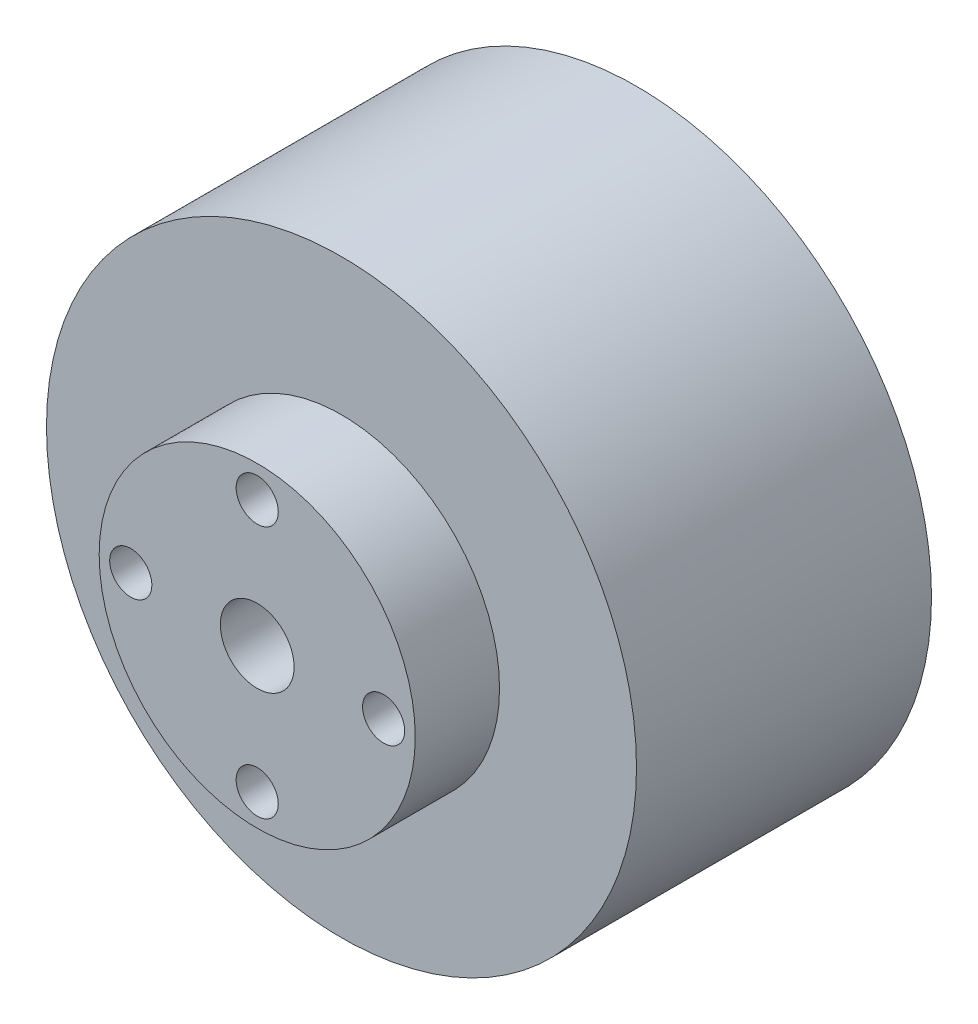
ISO-10303-21;
HEADER;
FILE_DESCRIPTION(('STEP AP214'),'2;1');
FILE_NAME('part.step','',(''),(''),'','','');
FILE_SCHEMA(('AUTOMOTIVE_DESIGN { 1 0 10303 214 1 1 1 1 }'));
ENDSEC;
DATA;
#1=APPLICATION_CONTEXT('core data for automotive mechanical design processes');
#2=APPLICATION_PROTOCOL_DEFINITION('international standard','automotive_design',2000,#1);
#3=PRODUCT_CONTEXT('',#1,'mechanical');
#4=PRODUCT('Part','Part','',(#3));
#5=PRODUCT_RELATED_PRODUCT_CATEGORY('part','',(#4));
#6=PRODUCT_DEFINITION_FORMATION('','',#4);
#7=PRODUCT_DEFINITION_CONTEXT('part definition',#1,'design');
#8=PRODUCT_DEFINITION('design','',#6,#7);
#9=PRODUCT_DEFINITION_SHAPE('','',#8);
#10=(LENGTH_UNIT() NAMED_UNIT(*) SI_UNIT(.MILLI.,.METRE.));
#11=(NAMED_UNIT(*) PLANE_ANGLE_UNIT() SI_UNIT($,.RADIAN.));
#12=(NAMED_UNIT(*) SI_UNIT($,.STERADIAN.) SOLID_ANGLE_UNIT());
#13=UNCERTAINTY_MEASURE_WITH_UNIT(LENGTH_MEASURE(1.E-05),#10,'distance_accuracy_value','');
#14=(GEOMETRIC_REPRESENTATION_CONTEXT(3) GLOBAL_UNCERTAINTY_ASSIGNED_CONTEXT((#13)) GLOBAL_UNIT_ASSIGNED_CONTEXT((#10,
#11,#12)) REPRESENTATION_CONTEXT('',''));
#15=CARTESIAN_POINT('',(0.,0.,0.));
#16=DIRECTION('',(0.,0.,1.));
#17=DIRECTION('',(1.,0.,0.));
#18=AXIS2_PLACEMENT_3D('',#15,#16,#17);
#19=CARTESIAN_POINT('',(0.,0.,14.));
#20=DIRECTION('',(0.,0.,-1.));
#21=DIRECTION('',(-1.,0.,0.));
#22=AXIS2_PLACEMENT_3D('',#19,#20,#21);
#23=CYLINDRICAL_SURFACE('',#22,14.);
#24=CARTESIAN_POINT('',(0.,0.,14.));
#25=DIRECTION('',(0.,0.,1.));
#26=DIRECTION('',(1.,0.,0.));
#27=AXIS2_PLACEMENT_3D('',#24,#25,#26);
#28=CIRCLE('',#27,14.);
#29=CARTESIAN_POINT('',(14.,0.,14.));
#30=VERTEX_POINT('',#29);
#31=EDGE_CURVE('E46',#30,#30,#28,.T.);
#32=ORIENTED_EDGE('',*,*,#31,.F.);
#33=EDGE_LOOP('',(#32));
#34=FACE_BOUND('',#33,.T.);
#35=CARTESIAN_POINT('',(0.,0.,0.));
#36=DIRECTION('',(0.,0.,1.));
#37=DIRECTION('',(1.,0.,0.));
#38=AXIS2_PLACEMENT_3D('',#35,#36,#37);
#39=CIRCLE('',#38,14.);
#40=CARTESIAN_POINT('',(14.,0.,0.));
#41=VERTEX_POINT('',#40);
#42=EDGE_CURVE('E41',#41,#41,#39,.T.);
#43=ORIENTED_EDGE('',*,*,#42,.T.);
#44=EDGE_LOOP('',(#43));
#45=FACE_BOUND('',#44,.T.);
#46=ADVANCED_FACE('F38',(#34,#45),#23,.T.);
#47=CARTESIAN_POINT('',(0.,0.,14.));
#48=DIRECTION('',(0.,0.,1.));
#49=DIRECTION('',(1.,0.,0.));
#50=AXIS2_PLACEMENT_3D('',#47,#48,#49);
#51=PLANE('',#50);
#52=CARTESIAN_POINT('',(0.,0.,14.));
#53=DIRECTION('',(0.,0.,1.));
#54=DIRECTION('',(1.,0.,0.));
#55=AXIS2_PLACEMENT_3D('',#52,#53,#54);
#56=CIRCLE('',#55,7.5);
#57=CARTESIAN_POINT('',(7.5,0.,14.));
#58=VERTEX_POINT('',#57);
#59=EDGE_CURVE('E10',#58,#58,#56,.T.);
#60=ORIENTED_EDGE('',*,*,#59,.F.);
#61=EDGE_LOOP('',(#60));
#62=FACE_BOUND('',#61,.T.);
#63=ORIENTED_EDGE('',*,*,#31,.T.);
#64=EDGE_LOOP('',(#63));
#65=FACE_BOUND('',#64,.T.);
#66=ADVANCED_FACE('F142',(#62,#65),#51,.T.);
#67=CARTESIAN_POINT('',(0.,0.,0.));
#68=DIRECTION('',(0.,0.,1.));
#69=DIRECTION('',(1.,0.,0.));
#70=AXIS2_PLACEMENT_3D('',#67,#68,#69);
#71=PLANE('',#70);
#72=CARTESIAN_POINT('',(0.,8.,0.));
#73=DIRECTION('',(0.,0.,1.));
#74=DIRECTION('',(1.,0.,0.));
#75=AXIS2_PLACEMENT_3D('',#72,#73,#74);
#76=CIRCLE('',#75,1.5);
#77=CARTESIAN_POINT('',(1.5,8.,0.));
#78=VERTEX_POINT('',#77);
#79=EDGE_CURVE('E122',#78,#78,#76,.T.);
#80=ORIENTED_EDGE('',*,*,#79,.T.);
#81=EDGE_LOOP('',(#80));
#82=FACE_BOUND('',#81,.T.);
#83=CARTESIAN_POINT('',(-8.,0.,0.));
#84=DIRECTION('',(0.,0.,1.));
#85=DIRECTION('',(1.,0.,0.));
#86=AXIS2_PLACEMENT_3D('',#83,#84,#85);
#87=CIRCLE('',#86,1.5);
#88=CARTESIAN_POINT('',(-6.5,0.,0.));
#89=VERTEX_POINT('',#88);
#90=EDGE_CURVE('E114',#89,#89,#87,.T.);
#91=ORIENTED_EDGE('',*,*,#90,.T.);
#92=EDGE_LOOP('',(#91));
#93=FACE_BOUND('',#92,.T.);
#94=CARTESIAN_POINT('',(0.,-8.,0.));
#95=DIRECTION('',(0.,0.,1.));
#96=DIRECTION('',(1.,0.,0.));
#97=AXIS2_PLACEMENT_3D('',#94,#95,#96);
#98=CIRCLE('',#97,1.5);
#99=CARTESIAN_POINT('',(1.5,-8.,0.));
#100=VERTEX_POINT('',#99);
#101=EDGE_CURVE('E106',#100,#100,#98,.T.);
#102=ORIENTED_EDGE('',*,*,#101,.T.);
#103=EDGE_LOOP('',(#102));
#104=FACE_BOUND('',#103,.T.);
#105=CARTESIAN_POINT('',(8.,0.,0.));
#106=DIRECTION('',(0.,0.,1.));
#107=DIRECTION('',(1.,0.,0.));
#108=AXIS2_PLACEMENT_3D('',#105,#106,#107);
#109=CIRCLE('',#108,1.5);
#110=CARTESIAN_POINT('',(9.5,0.,0.));
#111=VERTEX_POINT('',#110);
#112=EDGE_CURVE('E98',#111,#111,#109,.T.);
#113=ORIENTED_EDGE('',*,*,#112,.T.);
#114=EDGE_LOOP('',(#113));
#115=FACE_BOUND('',#114,.T.);
#116=CARTESIAN_POINT('',(0.,0.,0.));
#117=DIRECTION('',(0.,0.,1.));
#118=DIRECTION('',(1.,0.,0.));
#119=AXIS2_PLACEMENT_3D('',#116,#117,#118);
#120=CIRCLE('',#119,1.75);
#121=CARTESIAN_POINT('',(1.75,0.,0.));
#122=VERTEX_POINT('',#121);
#123=EDGE_CURVE('E57',#122,#122,#120,.T.);
#124=ORIENTED_EDGE('',*,*,#123,.T.);
#125=EDGE_LOOP('',(#124));
#126=FACE_BOUND('',#125,.T.);
#127=ORIENTED_EDGE('',*,*,#42,.F.);
#128=EDGE_LOOP('',(#127));
#129=FACE_BOUND('',#128,.T.);
#130=ADVANCED_FACE('F147',(#82,#93,#104,#115,#126,#129),#71,.F.);
#131=CARTESIAN_POINT('',(0.,0.,18.));
#132=DIRECTION('',(0.,0.,-1.));
#133=DIRECTION('',(-1.,0.,0.));
#134=AXIS2_PLACEMENT_3D('',#131,#132,#133);
#135=CYLINDRICAL_SURFACE('',#134,7.5);
#136=CARTESIAN_POINT('',(0.,0.,18.));
#137=DIRECTION('',(0.,0.,1.));
#138=DIRECTION('',(1.,0.,0.));
#139=AXIS2_PLACEMENT_3D('',#136,#137,#138);
#140=CIRCLE('',#139,7.5);
#141=CARTESIAN_POINT('',(7.5,0.,18.));
#142=VERTEX_POINT('',#141);
#143=EDGE_CURVE('E53',#142,#142,#140,.T.);
#144=ORIENTED_EDGE('',*,*,#143,.F.);
#145=EDGE_LOOP('',(#144));
#146=FACE_BOUND('',#145,.T.);
#147=ORIENTED_EDGE('',*,*,#59,.T.);
#148=EDGE_LOOP('',(#147));
#149=FACE_BOUND('',#148,.T.);
#150=ADVANCED_FACE('F157',(#146,#149),#135,.T.);
#151=CARTESIAN_POINT('',(0.,0.,18.));
#152=DIRECTION('',(0.,0.,1.));
#153=DIRECTION('',(1.,0.,0.));
#154=AXIS2_PLACEMENT_3D('',#151,#152,#153);
#155=PLANE('',#154);
#156=CARTESIAN_POINT('',(6.00000000000001,0.,18.));
#157=DIRECTION('',(0.,0.,1.));
#158=DIRECTION('',(1.,0.,0.));
#159=AXIS2_PLACEMENT_3D('',#156,#157,#158);
#160=CIRCLE('',#159,1.);
#161=CARTESIAN_POINT('',(7.00000000000001,0.,18.));
#162=VERTEX_POINT('',#161);
#163=EDGE_CURVE('E91',#162,#162,#160,.T.);
#164=ORIENTED_EDGE('',*,*,#163,.F.);
#165=EDGE_LOOP('',(#164));
#166=FACE_BOUND('',#165,.T.);
#167=CARTESIAN_POINT('',(-6.00000000000001,0.,18.));
#168=DIRECTION('',(0.,0.,1.));
#169=DIRECTION('',(1.,0.,0.));
#170=AXIS2_PLACEMENT_3D('',#167,#168,#169);
#171=CIRCLE('',#170,1.);
#172=CARTESIAN_POINT('',(-5.00000000000001,0.,18.));
#173=VERTEX_POINT('',#172);
#174=EDGE_CURVE('E87',#173,#173,#171,.T.);
#175=ORIENTED_EDGE('',*,*,#174,.F.);
#176=EDGE_LOOP('',(#175));
#177=FACE_BOUND('',#176,.T.);
#178=CARTESIAN_POINT('',(0.,-6.,18.));
#179=DIRECTION('',(0.,0.,1.));
#180=DIRECTION('',(1.,0.,0.));
#181=AXIS2_PLACEMENT_3D('',#178,#179,#180);
#182=CIRCLE('',#181,1.);
#183=CARTESIAN_POINT('',(1.,-6.,18.));
#184=VERTEX_POINT('',#183);
#185=EDGE_CURVE('E79',#184,#184,#182,.T.);
#186=ORIENTED_EDGE('',*,*,#185,.F.);
#187=EDGE_LOOP('',(#186));
#188=FACE_BOUND('',#187,.T.);
#189=CARTESIAN_POINT('',(0.,6.,18.));
#190=DIRECTION('',(0.,0.,1.));
#191=DIRECTION('',(1.,0.,0.));
#192=AXIS2_PLACEMENT_3D('',#189,#190,#191);
#193=CIRCLE('',#192,1.);
#194=CARTESIAN_POINT('',(1.,6.,18.));
#195=VERTEX_POINT('',#194);
#196=EDGE_CURVE('E70',#195,#195,#193,.T.);
#197=ORIENTED_EDGE('',*,*,#196,.F.);
#198=EDGE_LOOP('',(#197));
#199=FACE_BOUND('',#198,.T.);
#200=CARTESIAN_POINT('',(0.,0.,18.));
#201=DIRECTION('',(0.,0.,1.));
#202=DIRECTION('',(1.,0.,0.));
#203=AXIS2_PLACEMENT_3D('',#200,#201,#202);
#204=CIRCLE('',#203,1.75);
#205=CARTESIAN_POINT('',(1.75,0.,18.));
#206=VERTEX_POINT('',#205);
#207=EDGE_CURVE('E58',#206,#206,#204,.T.);
#208=ORIENTED_EDGE('',*,*,#207,.F.);
#209=EDGE_LOOP('',(#208));
#210=FACE_BOUND('',#209,.T.);
#211=ORIENTED_EDGE('',*,*,#143,.T.);
#212=EDGE_LOOP('',(#211));
#213=FACE_BOUND('',#212,.T.);
#214=ADVANCED_FACE('F163',(#166,#177,#188,#199,#210,#213),#155,.T.);
#215=CARTESIAN_POINT('',(0.,0.,0.));
#216=DIRECTION('',(0.,0.,1.));
#217=DIRECTION('',(1.,0.,0.));
#218=AXIS2_PLACEMENT_3D('',#215,#216,#217);
#219=CYLINDRICAL_SURFACE('',#218,1.75);
#220=ORIENTED_EDGE('',*,*,#123,.F.);
#221=EDGE_LOOP('',(#220));
#222=FACE_BOUND('',#221,.T.);
#223=ORIENTED_EDGE('',*,*,#207,.T.);
#224=EDGE_LOOP('',(#223));
#225=FACE_BOUND('',#224,.T.);
#226=ADVANCED_FACE('F170',(#222,#225),#219,.F.);
#227=CARTESIAN_POINT('',(0.,6.,15.));
#228=DIRECTION('',(0.,0.,1.));
#229=DIRECTION('',(1.,0.,0.));
#230=AXIS2_PLACEMENT_3D('',#227,#228,#229);
#231=CYLINDRICAL_SURFACE('',#230,1.);
#232=CARTESIAN_POINT('',(0.,6.,15.));
#233=DIRECTION('',(0.,0.,1.));
#234=DIRECTION('',(1.,0.,0.));
#235=AXIS2_PLACEMENT_3D('',#232,#233,#234);
#236=CIRCLE('',#235,1.);
#237=CARTESIAN_POINT('',(1.,6.,15.));
#238=VERTEX_POINT('',#237);
#239=EDGE_CURVE('E66',#238,#238,#236,.T.);
#240=ORIENTED_EDGE('',*,*,#239,.F.);
#241=EDGE_LOOP('',(#240));
#242=FACE_BOUND('',#241,.T.);
#243=ORIENTED_EDGE('',*,*,#196,.T.);
#244=EDGE_LOOP('',(#243));
#245=FACE_BOUND('',#244,.T.);
#246=ADVANCED_FACE('F174',(#242,#245),#231,.F.);
#247=CARTESIAN_POINT('',(0.,6.,15.));
#248=DIRECTION('',(0.,0.,1.));
#249=DIRECTION('',(1.,0.,0.));
#250=AXIS2_PLACEMENT_3D('',#247,#248,#249);
#251=PLANE('',#250);
#252=ORIENTED_EDGE('',*,*,#239,.T.);
#253=EDGE_LOOP('',(#252));
#254=FACE_BOUND('',#253,.T.);
#255=ADVANCED_FACE('F176',(#254),#251,.T.);
#256=CARTESIAN_POINT('',(0.,-6.,15.));
#257=DIRECTION('',(0.,0.,1.));
#258=DIRECTION('',(1.,0.,0.));
#259=AXIS2_PLACEMENT_3D('',#256,#257,#258);
#260=CYLINDRICAL_SURFACE('',#259,1.);
#261=CARTESIAN_POINT('',(0.,-6.,15.));
#262=DIRECTION('',(0.,0.,1.));
#263=DIRECTION('',(1.,0.,0.));
#264=AXIS2_PLACEMENT_3D('',#261,#262,#263);
#265=CIRCLE('',#264,1.);
#266=CARTESIAN_POINT('',(1.,-6.,15.));
#267=VERTEX_POINT('',#266);
#268=EDGE_CURVE('E75',#267,#267,#265,.T.);
#269=ORIENTED_EDGE('',*,*,#268,.F.);
#270=EDGE_LOOP('',(#269));
#271=FACE_BOUND('',#270,.T.);
#272=ORIENTED_EDGE('',*,*,#185,.T.);
#273=EDGE_LOOP('',(#272));
#274=FACE_BOUND('',#273,.T.);
#275=ADVANCED_FACE('F179',(#271,#274),#260,.F.);
#276=CARTESIAN_POINT('',(0.,-6.,15.));
#277=DIRECTION('',(0.,0.,1.));
#278=DIRECTION('',(1.,0.,0.));
#279=AXIS2_PLACEMENT_3D('',#276,#277,#278);
#280=PLANE('',#279);
#281=ORIENTED_EDGE('',*,*,#268,.T.);
#282=EDGE_LOOP('',(#281));
#283=FACE_BOUND('',#282,.T.);
#284=ADVANCED_FACE('F184',(#283),#280,.T.);
#285=CARTESIAN_POINT('',(-6.00000000000001,0.,15.));
#286=DIRECTION('',(0.,0.,1.));
#287=DIRECTION('',(1.,0.,0.));
#288=AXIS2_PLACEMENT_3D('',#285,#286,#287);
#289=CYLINDRICAL_SURFACE('',#288,1.);
#290=CARTESIAN_POINT('',(-6.00000000000001,0.,15.));
#291=DIRECTION('',(0.,0.,1.));
#292=DIRECTION('',(1.,0.,0.));
#293=AXIS2_PLACEMENT_3D('',#290,#291,#292);
#294=CIRCLE('',#293,1.);
#295=CARTESIAN_POINT('',(-5.00000000000001,0.,15.));
#296=VERTEX_POINT('',#295);
#297=EDGE_CURVE('E83',#296,#296,#294,.T.);
#298=ORIENTED_EDGE('',*,*,#297,.F.);
#299=EDGE_LOOP('',(#298));
#300=FACE_BOUND('',#299,.T.);
#301=ORIENTED_EDGE('',*,*,#174,.T.);
#302=EDGE_LOOP('',(#301));
#303=FACE_BOUND('',#302,.T.);
#304=ADVANCED_FACE('F187',(#300,#303),#289,.F.);
#305=CARTESIAN_POINT('',(-6.00000000000001,0.,15.));
#306=DIRECTION('',(0.,0.,1.));
#307=DIRECTION('',(1.,0.,0.));
#308=AXIS2_PLACEMENT_3D('',#305,#306,#307);
#309=PLANE('',#308);
#310=ORIENTED_EDGE('',*,*,#297,.T.);
#311=EDGE_LOOP('',(#310));
#312=FACE_BOUND('',#311,.T.);
#313=ADVANCED_FACE('F192',(#312),#309,.T.);
#314=CARTESIAN_POINT('',(6.00000000000001,0.,15.));
#315=DIRECTION('',(0.,0.,1.));
#316=DIRECTION('',(1.,0.,0.));
#317=AXIS2_PLACEMENT_3D('',#314,#315,#316);
#318=CYLINDRICAL_SURFACE('',#317,1.);
#319=CARTESIAN_POINT('',(6.00000000000001,0.,15.));
#320=DIRECTION('',(0.,0.,1.));
#321=DIRECTION('',(1.,0.,0.));
#322=AXIS2_PLACEMENT_3D('',#319,#320,#321);
#323=CIRCLE('',#322,1.);
#324=CARTESIAN_POINT('',(7.00000000000001,0.,15.));
#325=VERTEX_POINT('',#324);
#326=EDGE_CURVE('E62',#325,#325,#323,.T.);
#327=ORIENTED_EDGE('',*,*,#326,.F.);
#328=EDGE_LOOP('',(#327));
#329=FACE_BOUND('',#328,.T.);
#330=ORIENTED_EDGE('',*,*,#163,.T.);
#331=EDGE_LOOP('',(#330));
#332=FACE_BOUND('',#331,.T.);
#333=ADVANCED_FACE('F195',(#329,#332),#318,.F.);
#334=CARTESIAN_POINT('',(6.00000000000001,0.,15.));
#335=DIRECTION('',(0.,0.,1.));
#336=DIRECTION('',(1.,0.,0.));
#337=AXIS2_PLACEMENT_3D('',#334,#335,#336);
#338=PLANE('',#337);
#339=ORIENTED_EDGE('',*,*,#326,.T.);
#340=EDGE_LOOP('',(#339));
#341=FACE_BOUND('',#340,.T.);
#342=ADVANCED_FACE('F202',(#341),#338,.T.);
#343=CARTESIAN_POINT('',(8.,0.,3.));
#344=DIRECTION('',(0.,0.,-1.));
#345=DIRECTION('',(-1.,0.,0.));
#346=AXIS2_PLACEMENT_3D('',#343,#344,#345);
#347=CYLINDRICAL_SURFACE('',#346,1.5);
#348=CARTESIAN_POINT('',(8.,0.,3.));
#349=DIRECTION('',(0.,0.,1.));
#350=DIRECTION('',(1.,0.,0.));
#351=AXIS2_PLACEMENT_3D('',#348,#349,#350);
#352=CIRCLE('',#351,1.5);
#353=CARTESIAN_POINT('',(9.5,0.,3.));
#354=VERTEX_POINT('',#353);
#355=EDGE_CURVE('E102',#354,#354,#352,.T.);
#356=ORIENTED_EDGE('',*,*,#355,.T.);
#357=EDGE_LOOP('',(#356));
#358=FACE_BOUND('',#357,.T.);
#359=ORIENTED_EDGE('',*,*,#112,.F.);
#360=EDGE_LOOP('',(#359));
#361=FACE_BOUND('',#360,.T.);
#362=ADVANCED_FACE('F206',(#358,#361),#347,.F.);
#363=CARTESIAN_POINT('',(8.,0.,3.));
#364=DIRECTION('',(0.,0.,1.));
#365=DIRECTION('',(1.,0.,0.));
#366=AXIS2_PLACEMENT_3D('',#363,#364,#365);
#367=PLANE('',#366);
#368=ORIENTED_EDGE('',*,*,#355,.F.);
#369=EDGE_LOOP('',(#368));
#370=FACE_BOUND('',#369,.T.);
#371=ADVANCED_FACE('F210',(#370),#367,.F.);
#372=CARTESIAN_POINT('',(0.,-8.,3.));
#373=DIRECTION('',(0.,0.,-1.));
#374=DIRECTION('',(-1.,0.,0.));
#375=AXIS2_PLACEMENT_3D('',#372,#373,#374);
#376=CYLINDRICAL_SURFACE('',#375,1.5);
#377=CARTESIAN_POINT('',(0.,-8.,3.));
#378=DIRECTION('',(0.,0.,1.));
#379=DIRECTION('',(1.,0.,0.));
#380=AXIS2_PLACEMENT_3D('',#377,#378,#379);
#381=CIRCLE('',#380,1.5);
#382=CARTESIAN_POINT('',(1.5,-8.,3.));
#383=VERTEX_POINT('',#382);
#384=EDGE_CURVE('E110',#383,#383,#381,.T.);
#385=ORIENTED_EDGE('',*,*,#384,.T.);
#386=EDGE_LOOP('',(#385));
#387=FACE_BOUND('',#386,.T.);
#388=ORIENTED_EDGE('',*,*,#101,.F.);
#389=EDGE_LOOP('',(#388));
#390=FACE_BOUND('',#389,.T.);
#391=ADVANCED_FACE('F214',(#387,#390),#376,.F.);
#392=CARTESIAN_POINT('',(0.,-8.,3.));
#393=DIRECTION('',(0.,0.,1.));
#394=DIRECTION('',(1.,0.,0.));
#395=AXIS2_PLACEMENT_3D('',#392,#393,#394);
#396=PLANE('',#395);
#397=ORIENTED_EDGE('',*,*,#384,.F.);
#398=EDGE_LOOP('',(#397));
#399=FACE_BOUND('',#398,.T.);
#400=ADVANCED_FACE('F218',(#399),#396,.F.);
#401=CARTESIAN_POINT('',(-8.,0.,3.));
#402=DIRECTION('',(0.,0.,-1.));
#403=DIRECTION('',(-1.,0.,0.));
#404=AXIS2_PLACEMENT_3D('',#401,#402,#403);
#405=CYLINDRICAL_SURFACE('',#404,1.5);
#406=CARTESIAN_POINT('',(-8.,0.,3.));
#407=DIRECTION('',(0.,0.,1.));
#408=DIRECTION('',(1.,0.,0.));
#409=AXIS2_PLACEMENT_3D('',#406,#407,#408);
#410=CIRCLE('',#409,1.5);
#411=CARTESIAN_POINT('',(-6.5,0.,3.));
#412=VERTEX_POINT('',#411);
#413=EDGE_CURVE('E118',#412,#412,#410,.T.);
#414=ORIENTED_EDGE('',*,*,#413,.T.);
#415=EDGE_LOOP('',(#414));
#416=FACE_BOUND('',#415,.T.);
#417=ORIENTED_EDGE('',*,*,#90,.F.);
#418=EDGE_LOOP('',(#417));
#419=FACE_BOUND('',#418,.T.);
#420=ADVANCED_FACE('F222',(#416,#419),#405,.F.);
#421=CARTESIAN_POINT('',(-8.,0.,3.));
#422=DIRECTION('',(0.,0.,1.));
#423=DIRECTION('',(1.,0.,0.));
#424=AXIS2_PLACEMENT_3D('',#421,#422,#423);
#425=PLANE('',#424);
#426=ORIENTED_EDGE('',*,*,#413,.F.);
#427=EDGE_LOOP('',(#426));
#428=FACE_BOUND('',#427,.T.);
#429=ADVANCED_FACE('F139',(#428),#425,.F.);
#430=CARTESIAN_POINT('',(0.,8.,3.));
#431=DIRECTION('',(0.,0.,-1.));
#432=DIRECTION('',(-1.,0.,0.));
#433=AXIS2_PLACEMENT_3D('',#430,#431,#432);
#434=CYLINDRICAL_SURFACE('',#433,1.5);
#435=CARTESIAN_POINT('',(0.,8.,3.));
#436=DIRECTION('',(0.,0.,1.));
#437=DIRECTION('',(1.,0.,0.));
#438=AXIS2_PLACEMENT_3D('',#435,#436,#437);
#439=CIRCLE('',#438,1.5);
#440=CARTESIAN_POINT('',(1.5,8.,3.));
#441=VERTEX_POINT('',#440);
#442=EDGE_CURVE('E71',#441,#441,#439,.T.);
#443=ORIENTED_EDGE('',*,*,#442,.T.);
#444=EDGE_LOOP('',(#443));
#445=FACE_BOUND('',#444,.T.);
#446=ORIENTED_EDGE('',*,*,#79,.F.);
#447=EDGE_LOOP('',(#446));
#448=FACE_BOUND('',#447,.T.);
#449=ADVANCED_FACE('F130',(#445,#448),#434,.F.);
#450=CARTESIAN_POINT('',(0.,8.,3.));
#451=DIRECTION('',(0.,0.,1.));
#452=DIRECTION('',(1.,0.,0.));
#453=AXIS2_PLACEMENT_3D('',#450,#451,#452);
#454=PLANE('',#453);
#455=ORIENTED_EDGE('',*,*,#442,.F.);
#456=EDGE_LOOP('',(#455));
#457=FACE_BOUND('',#456,.T.);
#458=ADVANCED_FACE('F133',(#457),#454,.F.);
#459=CLOSED_SHELL('',(#46,#66,#130,#150,#214,#226,#246,#255,#275,#284,#304,#313,#333,#342,#362,
#371,#391,#400,#420,#429,#449,#458));
#460=MANIFOLD_SOLID_BREP('B2',#459);
#461=ADVANCED_BREP_SHAPE_REPRESENTATION('',(#18,#460),#14);
#462=SHAPE_DEFINITION_REPRESENTATION(#9,#461);
ENDSEC;
END-ISO-10303-21;
